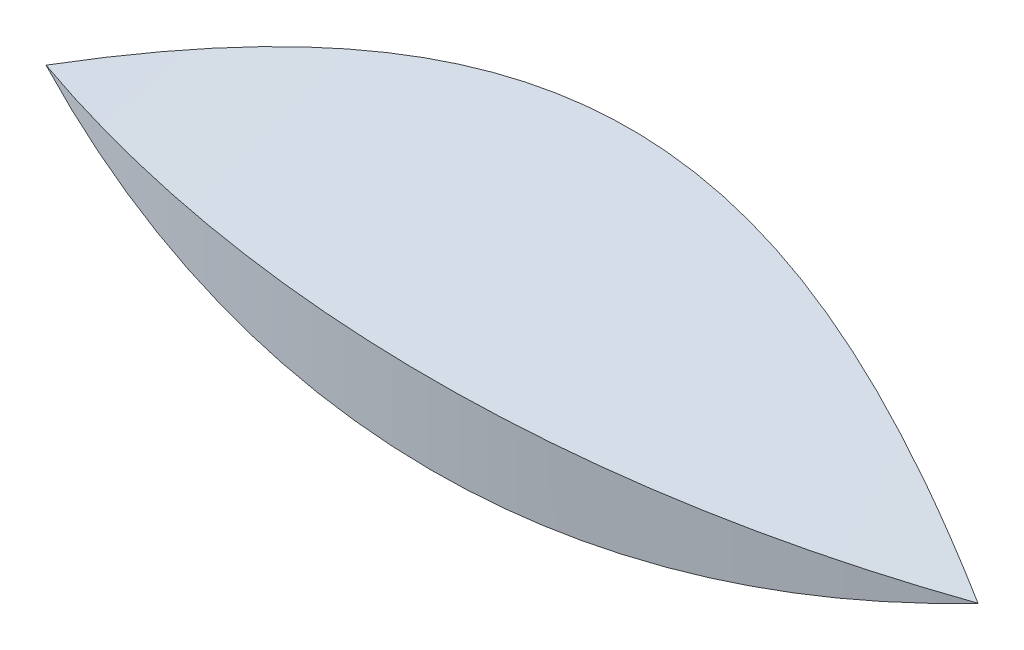
ISO-10303-21;
HEADER;
FILE_DESCRIPTION(('STEP AP214'),'2;1');
FILE_NAME('part.step','',(''),(''),'','','');
FILE_SCHEMA(('AUTOMOTIVE_DESIGN { 1 0 10303 214 1 1 1 1 }'));
ENDSEC;
DATA;
#1=APPLICATION_CONTEXT('core data for automotive mechanical design processes');
#2=APPLICATION_PROTOCOL_DEFINITION('international standard','automotive_design',2000,#1);
#3=PRODUCT_CONTEXT('',#1,'mechanical');
#4=PRODUCT('Part','Part','',(#3));
#5=PRODUCT_RELATED_PRODUCT_CATEGORY('part','',(#4));
#6=PRODUCT_DEFINITION_FORMATION('','',#4);
#7=PRODUCT_DEFINITION_CONTEXT('part definition',#1,'design');
#8=PRODUCT_DEFINITION('design','',#6,#7);
#9=PRODUCT_DEFINITION_SHAPE('','',#8);
#10=(LENGTH_UNIT() NAMED_UNIT(*) SI_UNIT(.MILLI.,.METRE.));
#11=(NAMED_UNIT(*) PLANE_ANGLE_UNIT() SI_UNIT($,.RADIAN.));
#12=(NAMED_UNIT(*) SI_UNIT($,.STERADIAN.) SOLID_ANGLE_UNIT());
#13=UNCERTAINTY_MEASURE_WITH_UNIT(LENGTH_MEASURE(1.E-05),#10,'distance_accuracy_value','');
#14=(GEOMETRIC_REPRESENTATION_CONTEXT(3) GLOBAL_UNCERTAINTY_ASSIGNED_CONTEXT((#13)) GLOBAL_UNIT_ASSIGNED_CONTEXT((#10,
#11,#12)) REPRESENTATION_CONTEXT('',''));
#15=CARTESIAN_POINT('',(0.,0.,0.));
#16=DIRECTION('',(0.,0.,1.));
#17=DIRECTION('',(1.,0.,0.));
#18=AXIS2_PLACEMENT_3D('',#15,#16,#17);
#19=CARTESIAN_POINT('',(17.55,-17.1993005,24.));
#20=DIRECTION('',(0.,-1.,0.));
#21=DIRECTION('',(-1.,0.,0.));
#22=AXIS2_PLACEMENT_3D('',#19,#20,#21);
#23=CYLINDRICAL_SURFACE('',#22,0.625);
#24=CARTESIAN_POINT('',(17.55,-17.2,24.));
#25=DIRECTION('',(0.,-1.,0.));
#26=DIRECTION('',(0.329570447697803,0.,0.944130986677309));
#27=AXIS2_PLACEMENT_3D('',#24,#25,#26);
#28=CIRCLE('',#27,0.6250000000035);
#29=CARTESIAN_POINT('',(17.75598152981,-17.2,24.59008186667));
#30=VERTEX_POINT('',#29);
#31=CARTESIAN_POINT('',(17.34401847019,-17.2,24.59008186667));
#32=VERTEX_POINT('',#31);
#33=EDGE_CURVE('E11',#30,#32,#28,.T.);
#34=ORIENTED_EDGE('',*,*,#33,.T.);
#35=CARTESIAN_POINT('',(17.34401847019,-17.20000000001,24.59008186667));
#36=CARTESIAN_POINT('',(17.37834872516,-17.21200327466,24.60206562492));
#37=CARTESIAN_POINT('',(17.44700923509,-17.22934487508,24.61937902923));
#38=CARTESIAN_POINT('',(17.55,-17.23779006247,24.62781048539));
#39=CARTESIAN_POINT('',(17.65299076491,-17.22934487508,24.61937902923));
#40=CARTESIAN_POINT('',(17.72165127484,-17.21200327466,24.60206562492));
#41=CARTESIAN_POINT('',(17.75598152981,-17.20000000001,24.59008186667));
#42=B_SPLINE_CURVE_WITH_KNOTS('',3,(#35,#36,#37,#38,#39,#40,#41),.UNSPECIFIED.,.F.,.F.,(4,1,1,1,
4),(0.,0.25,0.5,0.75,1.),.UNSPECIFIED.);
#43=EDGE_CURVE('E20',#32,#30,#42,.T.);
#44=ORIENTED_EDGE('',*,*,#43,.T.);
#45=EDGE_LOOP('',(#34,#44));
#46=FACE_BOUND('',#45,.T.);
#47=ADVANCED_FACE('F17',(#46),#23,.T.);
#48=CARTESIAN_POINT('',(17.55,-17.17377403674,24.));
#49=DIRECTION('',(0.,-1.,0.));
#50=DIRECTION('',(-1.,0.,0.));
#51=AXIS2_PLACEMENT_3D('',#48,#49,#50);
#52=CONICAL_SURFACE('',#51,0.5813526674419,1.02974425866337);
#53=ORIENTED_EDGE('',*,*,#33,.F.);
#54=CARTESIAN_POINT('',(17.34401847019,-17.2,24.59008186667));
#55=CARTESIAN_POINT('',(17.34929171035,-17.19759187521,24.58767765731));
#56=CARTESIAN_POINT('',(17.35968326949,-17.19296313355,24.58305644162));
#57=CARTESIAN_POINT('',(17.37478182626,-17.18658952098,24.57669319206));
#58=CARTESIAN_POINT('',(17.38945433369,-17.1807542555,24.57086741427));
#59=CARTESIAN_POINT('',(17.40372847345,-17.17544251512,24.56556431038));
#60=CARTESIAN_POINT('',(17.41765873629,-17.17063030583,24.56075992537));
#61=CARTESIAN_POINT('',(17.43130414969,-17.16629550173,24.55643216933));
#62=CARTESIAN_POINT('',(17.44472658025,-17.1624199823,24.5525629512));
#63=CARTESIAN_POINT('',(17.45790114014,-17.15901156141,24.54916007215));
#64=CARTESIAN_POINT('',(17.47081921043,-17.15606830802,24.54622160426));
#65=CARTESIAN_POINT('',(17.48347096227,-17.15358474712,24.54374208144));
#66=CARTESIAN_POINT('',(17.49587223717,-17.15154705719,24.54170770463));
#67=CARTESIAN_POINT('',(17.50807506227,-17.14993648423,24.54009975035));
#68=CARTESIAN_POINT('',(17.52014506678,-17.14873764886,24.53890286419));
#69=CARTESIAN_POINT('',(17.5321230652,-17.14794273606,24.53810924386));
#70=CARTESIAN_POINT('',(17.54403740737,-17.1475466689,24.53771382068));
#71=CARTESIAN_POINT('',(17.55593571199,-17.1475462158,24.53771336831));
#72=CARTESIAN_POINT('',(17.56785051213,-17.14794142283,24.53810793276));
#73=CARTESIAN_POINT('',(17.57982479413,-17.14873525083,24.53890047006));
#74=CARTESIAN_POINT('',(17.59188599862,-17.14993198326,24.5400952567));
#75=CARTESIAN_POINT('',(17.60409745666,-17.15154244519,24.54170310013));
#76=CARTESIAN_POINT('',(17.61650577562,-17.1535805056,24.54373784681));
#77=CARTESIAN_POINT('',(17.62916257158,-17.15606434159,24.54621764428));
#78=CARTESIAN_POINT('',(17.64209395021,-17.15901022598,24.54915873888));
#79=CARTESIAN_POINT('',(17.65527385388,-17.162420181,24.55256314958));
#80=CARTESIAN_POINT('',(17.6686830273,-17.16629166171,24.55642833556));
#81=CARTESIAN_POINT('',(17.68233507807,-17.17062816455,24.56075778758));
#82=CARTESIAN_POINT('',(17.69627022479,-17.17544202808,24.56556382413));
#83=CARTESIAN_POINT('',(17.71054563979,-17.180754246,24.57086740479));
#84=CARTESIAN_POINT('',(17.72521705984,-17.18658907493,24.57669274674));
#85=CARTESIAN_POINT('',(17.74031501996,-17.19296238768,24.58305569697));
#86=CARTESIAN_POINT('',(17.75070755908,-17.19759154158,24.58767732422));
#87=CARTESIAN_POINT('',(17.75598152981,-17.2,24.59008186667));
#88=B_SPLINE_CURVE_WITH_KNOTS('',3,(#54,#55,#56,#57,#58,#59,#60,#61,#62,#63,#64,#65,#66,#67,#68,
#69,#70,#71,#72,#73,#74,#75,#76,#77,#78,#79,#80,#81,#82,#83,#84,#85,#86,#87),.UNSPECIFIED.,.F.,
.F.,(4,1,1,1,1,1,1,1,1,1,1,1,1,1,1,1,1,1,1,1,1,1,1,1,1,1,1,1,1,1,1,4),(0.,0.03225806451613,
0.06451612903226,0.09677419354839,0.1290322580645,0.1612903225806,0.1935483870968,
0.2258064516129,0.258064516129,0.2903225806452,0.3225806451613,0.3548387096774,0.3870967741935,
0.4193548387097,0.4516129032258,0.4838709677419,0.5161290322581,0.5483870967742,0.5806451612903,
0.6129032258065,0.6451612903226,0.6774193548387,0.7096774193548,0.741935483871,0.7741935483871,
0.8064516129032,0.8387096774194,0.8709677419355,0.9032258064516,0.9354838709677,0.9677419354839,
1.),.UNSPECIFIED.);
#89=EDGE_CURVE('E28',#32,#30,#88,.T.);
#90=ORIENTED_EDGE('',*,*,#89,.F.);
#91=EDGE_LOOP('',(#53,#90));
#92=FACE_BOUND('',#91,.T.);
#93=ADVANCED_FACE('F45',(#92),#52,.T.);
#94=CARTESIAN_POINT('',(17.55,-17.19091546931,24.58101210673));
#95=DIRECTION('',(0.,0.706531228853786,0.707681865427086));
#96=DIRECTION('',(1.,0.,0.));
#97=AXIS2_PLACEMENT_3D('',#94,#95,#96);
#98=PLANE('',#97);
#99=ORIENTED_EDGE('',*,*,#43,.F.);
#100=ORIENTED_EDGE('',*,*,#89,.T.);
#101=EDGE_LOOP('',(#99,#100));
#102=FACE_BOUND('',#101,.T.);
#103=ADVANCED_FACE('F48',(#102),#98,.F.);
#104=CLOSED_SHELL('',(#47,#93,#103));
#105=MANIFOLD_SOLID_BREP('B1',#104);
#106=ADVANCED_BREP_SHAPE_REPRESENTATION('',(#18,#105),#14);
#107=SHAPE_DEFINITION_REPRESENTATION(#9,#106);
ENDSEC;
END-ISO-10303-21;
